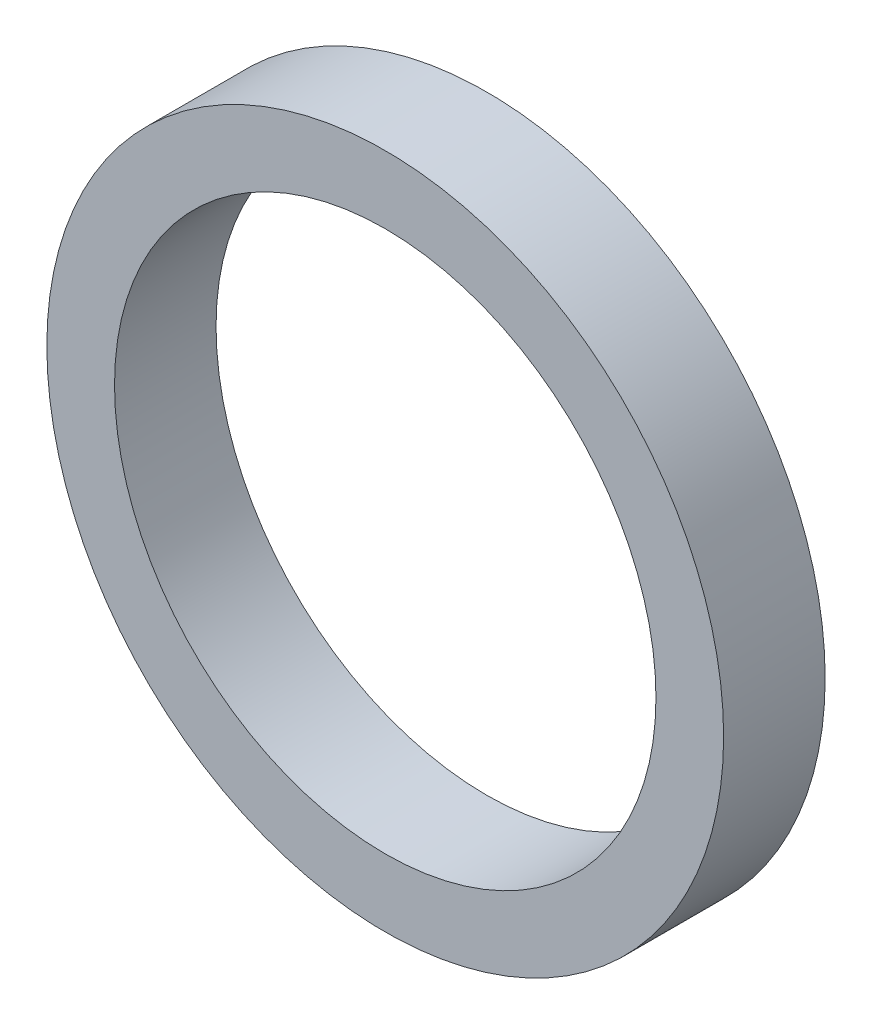
ISO-10303-21;
HEADER;
FILE_DESCRIPTION(('STEP AP214'),'2;1');
FILE_NAME('part.step','',(''),(''),'','','');
FILE_SCHEMA(('AUTOMOTIVE_DESIGN { 1 0 10303 214 1 1 1 1 }'));
ENDSEC;
DATA;
#1=APPLICATION_CONTEXT('core data for automotive mechanical design processes');
#2=APPLICATION_PROTOCOL_DEFINITION('international standard','automotive_design',2000,#1);
#3=PRODUCT_CONTEXT('',#1,'mechanical');
#4=PRODUCT('Part','Part','',(#3));
#5=PRODUCT_RELATED_PRODUCT_CATEGORY('part','',(#4));
#6=PRODUCT_DEFINITION_FORMATION('','',#4);
#7=PRODUCT_DEFINITION_CONTEXT('part definition',#1,'design');
#8=PRODUCT_DEFINITION('design','',#6,#7);
#9=PRODUCT_DEFINITION_SHAPE('','',#8);
#10=(LENGTH_UNIT() NAMED_UNIT(*) SI_UNIT(.MILLI.,.METRE.));
#11=(NAMED_UNIT(*) PLANE_ANGLE_UNIT() SI_UNIT($,.RADIAN.));
#12=(NAMED_UNIT(*) SI_UNIT($,.STERADIAN.) SOLID_ANGLE_UNIT());
#13=UNCERTAINTY_MEASURE_WITH_UNIT(LENGTH_MEASURE(1.E-05),#10,'distance_accuracy_value','');
#14=(GEOMETRIC_REPRESENTATION_CONTEXT(3) GLOBAL_UNCERTAINTY_ASSIGNED_CONTEXT((#13)) GLOBAL_UNIT_ASSIGNED_CONTEXT((#10,
#11,#12)) REPRESENTATION_CONTEXT('',''));
#15=CARTESIAN_POINT('',(0.,0.,0.));
#16=DIRECTION('',(0.,0.,1.));
#17=DIRECTION('',(1.,0.,0.));
#18=AXIS2_PLACEMENT_3D('',#15,#16,#17);
#19=CARTESIAN_POINT('',(0.,0.,0.75));
#20=DIRECTION('',(0.,0.,1.));
#21=DIRECTION('',(1.,0.,0.));
#22=AXIS2_PLACEMENT_3D('',#19,#20,#21);
#23=PLANE('',#22);
#24=CARTESIAN_POINT('',(0.,0.,0.75));
#25=DIRECTION('',(0.,0.,1.));
#26=DIRECTION('',(1.,0.,0.));
#27=AXIS2_PLACEMENT_3D('',#24,#25,#26);
#28=CIRCLE('',#27,5.);
#29=CARTESIAN_POINT('',(5.,0.,0.75));
#30=VERTEX_POINT('',#29);
#31=EDGE_CURVE('E10',#30,#30,#28,.T.);
#32=ORIENTED_EDGE('',*,*,#31,.T.);
#33=EDGE_LOOP('',(#32));
#34=FACE_BOUND('',#33,.T.);
#35=CARTESIAN_POINT('',(0.,0.,0.75));
#36=DIRECTION('',(0.,0.,1.));
#37=DIRECTION('',(1.,0.,0.));
#38=AXIS2_PLACEMENT_3D('',#35,#36,#37);
#39=CIRCLE('',#38,4.);
#40=CARTESIAN_POINT('',(4.,0.,0.75));
#41=VERTEX_POINT('',#40);
#42=EDGE_CURVE('E50',#41,#41,#39,.T.);
#43=ORIENTED_EDGE('',*,*,#42,.F.);
#44=EDGE_LOOP('',(#43));
#45=FACE_BOUND('',#44,.T.);
#46=ADVANCED_FACE('F39',(#34,#45),#23,.T.);
#47=CARTESIAN_POINT('',(0.,0.,-0.75));
#48=DIRECTION('',(0.,0.,1.));
#49=DIRECTION('',(1.,0.,0.));
#50=AXIS2_PLACEMENT_3D('',#47,#48,#49);
#51=PLANE('',#50);
#52=CARTESIAN_POINT('',(0.,0.,-0.75));
#53=DIRECTION('',(0.,0.,1.));
#54=DIRECTION('',(1.,0.,0.));
#55=AXIS2_PLACEMENT_3D('',#52,#53,#54);
#56=CIRCLE('',#55,5.);
#57=CARTESIAN_POINT('',(5.,0.,-0.75));
#58=VERTEX_POINT('',#57);
#59=EDGE_CURVE('E43',#58,#58,#56,.T.);
#60=ORIENTED_EDGE('',*,*,#59,.F.);
#61=EDGE_LOOP('',(#60));
#62=FACE_BOUND('',#61,.T.);
#63=CARTESIAN_POINT('',(0.,0.,-0.75));
#64=DIRECTION('',(0.,0.,1.));
#65=DIRECTION('',(1.,0.,0.));
#66=AXIS2_PLACEMENT_3D('',#63,#64,#65);
#67=CIRCLE('',#66,4.);
#68=CARTESIAN_POINT('',(4.,0.,-0.75));
#69=VERTEX_POINT('',#68);
#70=EDGE_CURVE('E52',#69,#69,#67,.T.);
#71=ORIENTED_EDGE('',*,*,#70,.T.);
#72=EDGE_LOOP('',(#71));
#73=FACE_BOUND('',#72,.T.);
#74=ADVANCED_FACE('F62',(#62,#73),#51,.F.);
#75=CARTESIAN_POINT('',(0.,0.,0.75));
#76=DIRECTION('',(0.,0.,-1.));
#77=DIRECTION('',(-1.,0.,0.));
#78=AXIS2_PLACEMENT_3D('',#75,#76,#77);
#79=CYLINDRICAL_SURFACE('',#78,5.);
#80=ORIENTED_EDGE('',*,*,#31,.F.);
#81=EDGE_LOOP('',(#80));
#82=FACE_BOUND('',#81,.T.);
#83=ORIENTED_EDGE('',*,*,#59,.T.);
#84=EDGE_LOOP('',(#83));
#85=FACE_BOUND('',#84,.T.);
#86=ADVANCED_FACE('F41',(#82,#85),#79,.T.);
#87=CARTESIAN_POINT('',(0.,0.,0.75));
#88=DIRECTION('',(0.,0.,-1.));
#89=DIRECTION('',(-1.,0.,0.));
#90=AXIS2_PLACEMENT_3D('',#87,#88,#89);
#91=CYLINDRICAL_SURFACE('',#90,4.);
#92=ORIENTED_EDGE('',*,*,#42,.T.);
#93=EDGE_LOOP('',(#92));
#94=FACE_BOUND('',#93,.T.);
#95=ORIENTED_EDGE('',*,*,#70,.F.);
#96=EDGE_LOOP('',(#95));
#97=FACE_BOUND('',#96,.T.);
#98=ADVANCED_FACE('F58',(#94,#97),#91,.F.);
#99=CLOSED_SHELL('',(#46,#74,#86,#98));
#100=MANIFOLD_SOLID_BREP('B2',#99);
#101=ADVANCED_BREP_SHAPE_REPRESENTATION('',(#18,#100),#14);
#102=SHAPE_DEFINITION_REPRESENTATION(#9,#101);
ENDSEC;
END-ISO-10303-21;
